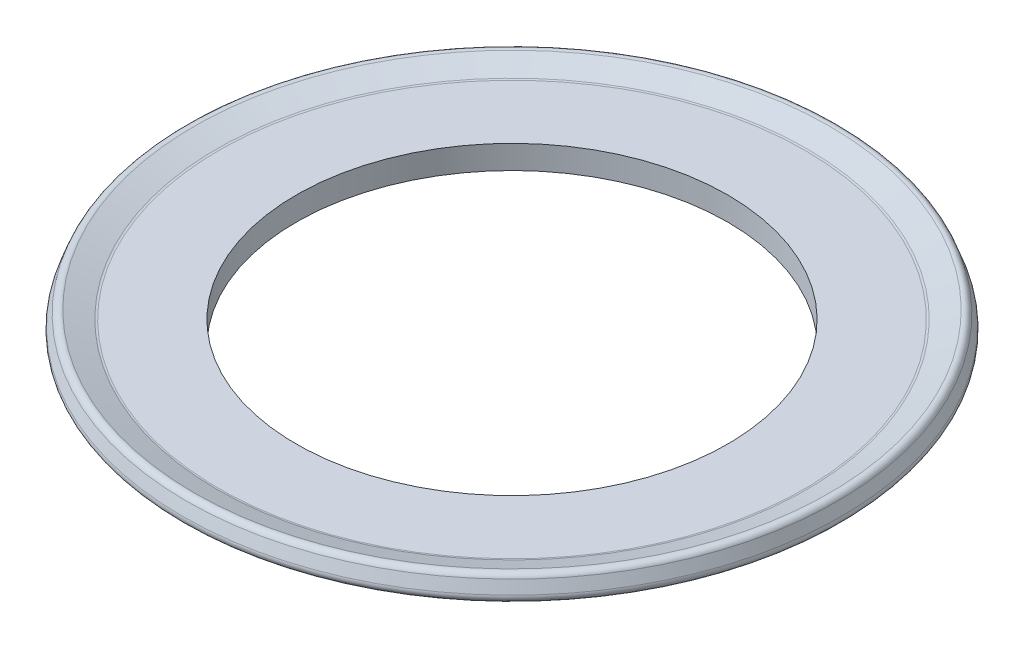
ISO-10303-21;
HEADER;
FILE_DESCRIPTION(('STEP AP214'),'2;1');
FILE_NAME('part.step','',(''),(''),'','','');
FILE_SCHEMA(('AUTOMOTIVE_DESIGN { 1 0 10303 214 1 1 1 1 }'));
ENDSEC;
DATA;
#1=APPLICATION_CONTEXT('core data for automotive mechanical design processes');
#2=APPLICATION_PROTOCOL_DEFINITION('international standard','automotive_design',2000,#1);
#3=PRODUCT_CONTEXT('',#1,'mechanical');
#4=PRODUCT('Part','Part','',(#3));
#5=PRODUCT_RELATED_PRODUCT_CATEGORY('part','',(#4));
#6=PRODUCT_DEFINITION_FORMATION('','',#4);
#7=PRODUCT_DEFINITION_CONTEXT('part definition',#1,'design');
#8=PRODUCT_DEFINITION('design','',#6,#7);
#9=PRODUCT_DEFINITION_SHAPE('','',#8);
#10=(LENGTH_UNIT() NAMED_UNIT(*) SI_UNIT(.MILLI.,.METRE.));
#11=(NAMED_UNIT(*) PLANE_ANGLE_UNIT() SI_UNIT($,.RADIAN.));
#12=(NAMED_UNIT(*) SI_UNIT($,.STERADIAN.) SOLID_ANGLE_UNIT());
#13=UNCERTAINTY_MEASURE_WITH_UNIT(LENGTH_MEASURE(1.E-05),#10,'distance_accuracy_value','');
#14=(GEOMETRIC_REPRESENTATION_CONTEXT(3) GLOBAL_UNCERTAINTY_ASSIGNED_CONTEXT((#13)) GLOBAL_UNIT_ASSIGNED_CONTEXT((#10,
#11,#12)) REPRESENTATION_CONTEXT('',''));
#15=CARTESIAN_POINT('',(0.,0.,0.));
#16=DIRECTION('',(0.,0.,1.));
#17=DIRECTION('',(1.,0.,0.));
#18=AXIS2_PLACEMENT_3D('',#15,#16,#17);
#19=CARTESIAN_POINT('',(0.,0.,0.));
#20=DIRECTION('',(0.,-1.,0.));
#21=DIRECTION('',(0.,0.,-1.));
#22=AXIS2_PLACEMENT_3D('',#19,#20,#21);
#23=PLANE('',#22);
#24=CARTESIAN_POINT('',(0.,0.,0.));
#25=DIRECTION('',(0.,-1.,0.));
#26=DIRECTION('',(0.,0.,-1.));
#27=AXIS2_PLACEMENT_3D('',#24,#25,#26);
#28=CIRCLE('',#27,9.16);
#29=CARTESIAN_POINT('',(0.,0.,-9.16));
#30=VERTEX_POINT('',#29);
#31=EDGE_CURVE('E10',#30,#30,#28,.T.);
#32=ORIENTED_EDGE('',*,*,#31,.F.);
#33=EDGE_LOOP('',(#32));
#34=FACE_BOUND('',#33,.T.);
#35=CARTESIAN_POINT('',(0.,0.,0.));
#36=DIRECTION('',(0.,-1.,0.));
#37=DIRECTION('',(0.,0.,-1.));
#38=AXIS2_PLACEMENT_3D('',#35,#36,#37);
#39=CIRCLE('',#38,12.5718365096458);
#40=CARTESIAN_POINT('',(0.,0.,-12.5718365096458));
#41=VERTEX_POINT('',#40);
#42=EDGE_CURVE('E36',#41,#41,#39,.T.);
#43=ORIENTED_EDGE('',*,*,#42,.T.);
#44=EDGE_LOOP('',(#43));
#45=FACE_BOUND('',#44,.T.);
#46=ADVANCED_FACE('F15',(#34,#45),#23,.T.);
#47=CARTESIAN_POINT('',(0.,1.,0.));
#48=DIRECTION('',(0.,-1.,0.));
#49=DIRECTION('',(0.,0.,-1.));
#50=AXIS2_PLACEMENT_3D('',#47,#48,#49);
#51=PLANE('',#50);
#52=CARTESIAN_POINT('',(0.,1.,0.));
#53=DIRECTION('',(0.,-1.,0.));
#54=DIRECTION('',(0.,0.,-1.));
#55=AXIS2_PLACEMENT_3D('',#52,#53,#54);
#56=CIRCLE('',#55,9.16);
#57=CARTESIAN_POINT('',(0.,1.,-9.16));
#58=VERTEX_POINT('',#57);
#59=EDGE_CURVE('E24',#58,#58,#56,.T.);
#60=ORIENTED_EDGE('',*,*,#59,.T.);
#61=EDGE_LOOP('',(#60));
#62=FACE_BOUND('',#61,.T.);
#63=CARTESIAN_POINT('',(0.,1.,0.));
#64=DIRECTION('',(0.,1.,0.));
#65=DIRECTION('',(0.,0.,-1.));
#66=AXIS2_PLACEMENT_3D('',#63,#64,#65);
#67=CIRCLE('',#66,12.4395912741144);
#68=CARTESIAN_POINT('',(0.,1.,-12.4395912741144));
#69=VERTEX_POINT('',#68);
#70=EDGE_CURVE('E32',#69,#69,#67,.T.);
#71=ORIENTED_EDGE('',*,*,#70,.T.);
#72=EDGE_LOOP('',(#71));
#73=FACE_BOUND('',#72,.T.);
#74=ADVANCED_FACE('F65',(#62,#73),#51,.F.);
#75=CARTESIAN_POINT('',(0.,1.,0.));
#76=DIRECTION('',(0.,1.,0.));
#77=DIRECTION('',(0.,0.,1.));
#78=AXIS2_PLACEMENT_3D('',#75,#76,#77);
#79=CONICAL_SURFACE('',#78,12.4836730192915,1.22173047639603);
#80=CARTESIAN_POINT('',(0.,1.36449496416858,0.));
#81=DIRECTION('',(0.,1.,0.));
#82=DIRECTION('',(0.,0.,-1.));
#83=AXIS2_PLACEMENT_3D('',#80,#81,#82);
#84=CIRCLE('',#83,13.4851147028496);
#85=CARTESIAN_POINT('',(0.,1.36449496416858,-13.4851147028496));
#86=VERTEX_POINT('',#85);
#87=EDGE_CURVE('E50',#86,#86,#84,.T.);
#88=ORIENTED_EDGE('',*,*,#87,.T.);
#89=EDGE_LOOP('',(#88));
#90=FACE_BOUND('',#89,.T.);
#91=CARTESIAN_POINT('',(0.,1.01507684480352,0.));
#92=DIRECTION('',(0.,-1.,0.));
#93=DIRECTION('',(0.,0.,1.));
#94=AXIS2_PLACEMENT_3D('',#91,#92,#93);
#95=CIRCLE('',#94,12.5250963099458);
#96=CARTESIAN_POINT('',(0.,1.01507684480352,12.5250963099458));
#97=VERTEX_POINT('',#96);
#98=EDGE_CURVE('E38',#97,#97,#95,.T.);
#99=ORIENTED_EDGE('',*,*,#98,.T.);
#100=EDGE_LOOP('',(#99));
#101=FACE_BOUND('',#100,.T.);
#102=ADVANCED_FACE('F75',(#90,#101),#79,.F.);
#103=CARTESIAN_POINT('',(0.,1.45,0.));
#104=DIRECTION('',(0.,-1.,0.));
#105=DIRECTION('',(0.,0.,-1.));
#106=AXIS2_PLACEMENT_3D('',#103,#104,#105);
#107=CONICAL_SURFACE('',#106,13.7200378580461,0.349065850398866);
#108=CARTESIAN_POINT('',(0.,0.745230534410571,0.));
#109=DIRECTION('',(0.,1.,0.));
#110=DIRECTION('',(0.,0.,1.));
#111=AXIS2_PLACEMENT_3D('',#108,#109,#110);
#112=CIRCLE('',#111,13.9765529655404);
#113=CARTESIAN_POINT('',(0.,0.745230534410571,13.9765529655404));
#114=VERTEX_POINT('',#113);
#115=EDGE_CURVE('E41',#114,#114,#112,.T.);
#116=ORIENTED_EDGE('',*,*,#115,.T.);
#117=EDGE_LOOP('',(#116));
#118=FACE_BOUND('',#117,.T.);
#119=CARTESIAN_POINT('',(0.,1.21507684480352,0.));
#120=DIRECTION('',(0.,-1.,0.));
#121=DIRECTION('',(0.,0.,1.));
#122=AXIS2_PLACEMENT_3D('',#119,#120,#121);
#123=CIRCLE('',#122,13.8055428938775);
#124=CARTESIAN_POINT('',(0.,1.21507684480352,13.8055428938775));
#125=VERTEX_POINT('',#124);
#126=EDGE_CURVE('E19',#125,#125,#123,.T.);
#127=ORIENTED_EDGE('',*,*,#126,.T.);
#128=EDGE_LOOP('',(#127));
#129=FACE_BOUND('',#128,.T.);
#130=ADVANCED_FACE('F77',(#118,#129),#107,.T.);
#131=CARTESIAN_POINT('',(0.,0.510307379214091,0.));
#132=DIRECTION('',(0.,1.,0.));
#133=DIRECTION('',(0.,0.,1.));
#134=AXIS2_PLACEMENT_3D('',#131,#132,#133);
#135=CONICAL_SURFACE('',#134,14.0620580013718,1.22173047639603);
#136=CARTESIAN_POINT('',(0.,0.424802343382673,0.));
#137=DIRECTION('',(0.,-1.,0.));
#138=DIRECTION('',(0.,0.,-1.));
#139=AXIS2_PLACEMENT_3D('',#136,#137,#138);
#140=CIRCLE('',#139,13.8271348461753);
#141=CARTESIAN_POINT('',(0.,0.424802343382673,-13.8271348461753));
#142=VERTEX_POINT('',#141);
#143=EDGE_CURVE('E44',#142,#142,#140,.T.);
#144=ORIENTED_EDGE('',*,*,#143,.T.);
#145=EDGE_LOOP('',(#144));
#146=FACE_BOUND('',#145,.T.);
#147=CARTESIAN_POINT('',(0.,0.0301536896070431,0.));
#148=DIRECTION('',(0.,1.,0.));
#149=DIRECTION('',(0.,0.,1.));
#150=AXIS2_PLACEMENT_3D('',#147,#148,#149);
#151=CIRCLE('',#150,12.7428465813086);
#152=CARTESIAN_POINT('',(0.,0.0301536896070431,12.7428465813086));
#153=VERTEX_POINT('',#152);
#154=EDGE_CURVE('E59',#153,#153,#151,.T.);
#155=ORIENTED_EDGE('',*,*,#154,.T.);
#156=EDGE_LOOP('',(#155));
#157=FACE_BOUND('',#156,.T.);
#158=ADVANCED_FACE('F85',(#146,#157),#135,.T.);
#159=CARTESIAN_POINT('',(0.,0.,0.));
#160=DIRECTION('',(0.,-1.,0.));
#161=DIRECTION('',(0.,0.,-1.));
#162=AXIS2_PLACEMENT_3D('',#159,#160,#161);
#163=CYLINDRICAL_SURFACE('',#162,9.16);
#164=ORIENTED_EDGE('',*,*,#31,.T.);
#165=EDGE_LOOP('',(#164));
#166=FACE_BOUND('',#165,.T.);
#167=ORIENTED_EDGE('',*,*,#59,.F.);
#168=EDGE_LOOP('',(#167));
#169=FACE_BOUND('',#168,.T.);
#170=ADVANCED_FACE('F71',(#166,#169),#163,.F.);
#171=CARTESIAN_POINT('',(0.,1.25,0.));
#172=DIRECTION('',(0.,-1.,0.));
#173=DIRECTION('',(0.,0.,-1.));
#174=AXIS2_PLACEMENT_3D('',#171,#172,#173);
#175=TOROIDAL_SURFACE('',#174,12.4395912741144,0.25);
#176=ORIENTED_EDGE('',*,*,#70,.F.);
#177=EDGE_LOOP('',(#176));
#178=FACE_BOUND('',#177,.T.);
#179=ORIENTED_EDGE('',*,*,#98,.F.);
#180=EDGE_LOOP('',(#179));
#181=FACE_BOUND('',#180,.T.);
#182=ADVANCED_FACE('F67',(#178,#181),#175,.F.);
#183=CARTESIAN_POINT('',(0.,0.659725498579151,0.));
#184=DIRECTION('',(0.,1.,0.));
#185=DIRECTION('',(0.,0.,1.));
#186=AXIS2_PLACEMENT_3D('',#183,#184,#185);
#187=TOROIDAL_SURFACE('',#186,13.7416298103439,0.25);
#188=ORIENTED_EDGE('',*,*,#115,.F.);
#189=EDGE_LOOP('',(#188));
#190=FACE_BOUND('',#189,.T.);
#191=ORIENTED_EDGE('',*,*,#143,.F.);
#192=EDGE_LOOP('',(#191));
#193=FACE_BOUND('',#192,.T.);
#194=ADVANCED_FACE('F70',(#190,#193),#187,.T.);
#195=CARTESIAN_POINT('',(0.,1.12957180897211,0.));
#196=DIRECTION('',(0.,1.,0.));
#197=DIRECTION('',(0.,0.,1.));
#198=AXIS2_PLACEMENT_3D('',#195,#196,#197);
#199=TOROIDAL_SURFACE('',#198,13.5706197386811,0.25);
#200=ORIENTED_EDGE('',*,*,#87,.F.);
#201=EDGE_LOOP('',(#200));
#202=FACE_BOUND('',#201,.T.);
#203=ORIENTED_EDGE('',*,*,#126,.F.);
#204=EDGE_LOOP('',(#203));
#205=FACE_BOUND('',#204,.T.);
#206=ADVANCED_FACE('F99',(#202,#205),#199,.T.);
#207=CARTESIAN_POINT('',(0.,0.5,0.));
#208=DIRECTION('',(0.,-1.,0.));
#209=DIRECTION('',(0.,0.,-1.));
#210=AXIS2_PLACEMENT_3D('',#207,#208,#209);
#211=TOROIDAL_SURFACE('',#210,12.5718365096458,0.5);
#212=ORIENTED_EDGE('',*,*,#42,.F.);
#213=EDGE_LOOP('',(#212));
#214=FACE_BOUND('',#213,.T.);
#215=ORIENTED_EDGE('',*,*,#154,.F.);
#216=EDGE_LOOP('',(#215));
#217=FACE_BOUND('',#216,.T.);
#218=ADVANCED_FACE('F17',(#214,#217),#211,.T.);
#219=CLOSED_SHELL('',(#46,#74,#102,#130,#158,#170,#182,#194,#206,#218));
#220=MANIFOLD_SOLID_BREP('B1',#219);
#221=ADVANCED_BREP_SHAPE_REPRESENTATION('',(#18,#220),#14);
#222=SHAPE_DEFINITION_REPRESENTATION(#9,#221);
ENDSEC;
END-ISO-10303-21;
